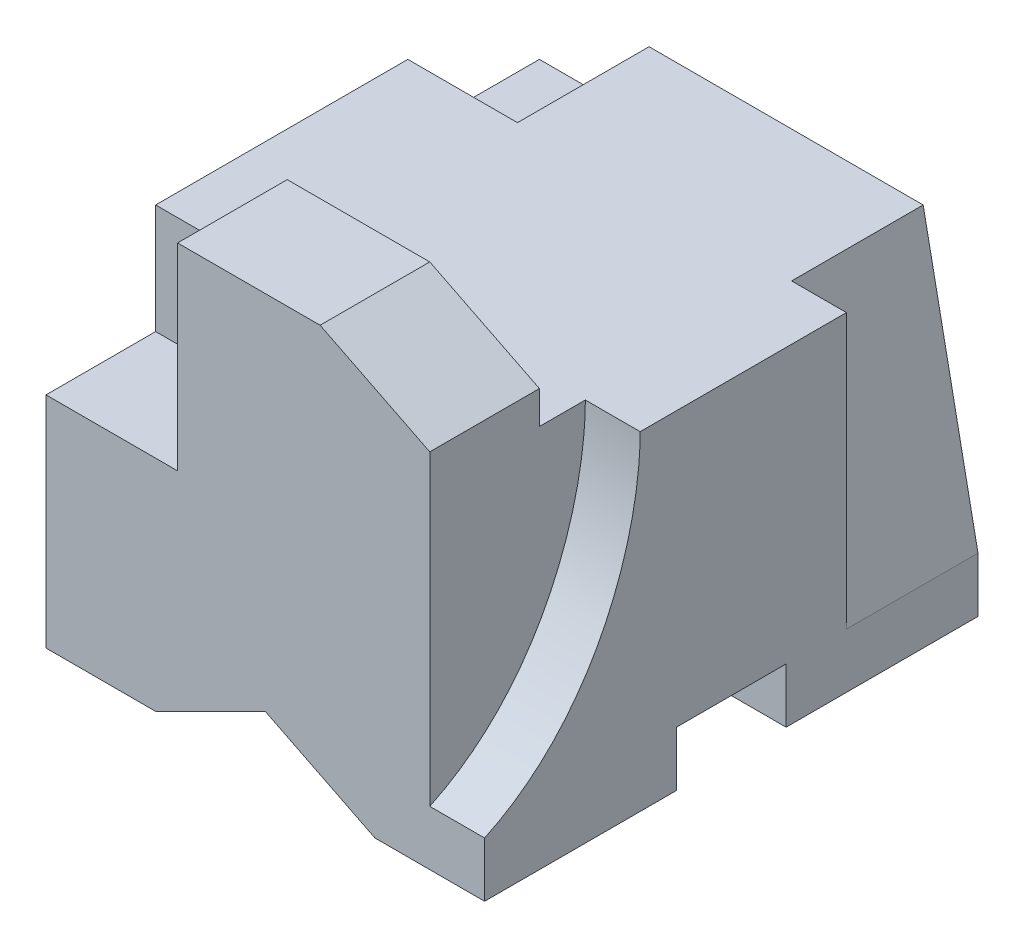
ISO-10303-21;
HEADER;
FILE_DESCRIPTION(('STEP AP214'),'2;1');
FILE_NAME('part.step','',(''),(''),'','','');
FILE_SCHEMA(('AUTOMOTIVE_DESIGN { 1 0 10303 214 1 1 1 1 }'));
ENDSEC;
DATA;
#1=APPLICATION_CONTEXT('core data for automotive mechanical design processes');
#2=APPLICATION_PROTOCOL_DEFINITION('international standard','automotive_design',2000,#1);
#3=PRODUCT_CONTEXT('',#1,'mechanical');
#4=PRODUCT('Part','Part','',(#3));
#5=PRODUCT_RELATED_PRODUCT_CATEGORY('part','',(#4));
#6=PRODUCT_DEFINITION_FORMATION('','',#4);
#7=PRODUCT_DEFINITION_CONTEXT('part definition',#1,'design');
#8=PRODUCT_DEFINITION('design','',#6,#7);
#9=PRODUCT_DEFINITION_SHAPE('','',#8);
#10=(LENGTH_UNIT() NAMED_UNIT(*) SI_UNIT(.MILLI.,.METRE.));
#11=(NAMED_UNIT(*) PLANE_ANGLE_UNIT() SI_UNIT($,.RADIAN.));
#12=(NAMED_UNIT(*) SI_UNIT($,.STERADIAN.) SOLID_ANGLE_UNIT());
#13=UNCERTAINTY_MEASURE_WITH_UNIT(LENGTH_MEASURE(1.E-05),#10,'distance_accuracy_value','');
#14=(GEOMETRIC_REPRESENTATION_CONTEXT(3) GLOBAL_UNCERTAINTY_ASSIGNED_CONTEXT((#13)) GLOBAL_UNIT_ASSIGNED_CONTEXT((#10,
#11,#12)) REPRESENTATION_CONTEXT('',''));
#15=CARTESIAN_POINT('',(0.,0.,0.));
#16=DIRECTION('',(0.,0.,1.));
#17=DIRECTION('',(1.,0.,0.));
#18=AXIS2_PLACEMENT_3D('',#15,#16,#17);
#19=CARTESIAN_POINT('',(40.,-15.,22.5));
#20=DIRECTION('',(0.,1.,0.));
#21=DIRECTION('',(0.,0.,1.));
#22=AXIS2_PLACEMENT_3D('',#19,#20,#21);
#23=PLANE('',#22);
#24=DIRECTION('',(1.,0.,0.));
#25=VECTOR('',#24,1.);
#26=CARTESIAN_POINT('',(0.,-15.,5.));
#27=LINE('',#26,#25);
#28=CARTESIAN_POINT('',(0.,-15.,5.));
#29=VERTEX_POINT('',#28);
#30=CARTESIAN_POINT('',(10.,-15.,4.99999999999999));
#31=VERTEX_POINT('',#30);
#32=EDGE_CURVE('E391',#29,#31,#27,.T.);
#33=ORIENTED_EDGE('',*,*,#32,.T.);
#34=DIRECTION('',(0.,0.,1.));
#35=VECTOR('',#34,1.);
#36=CARTESIAN_POINT('',(10.,-15.,-22.5));
#37=LINE('',#36,#35);
#38=CARTESIAN_POINT('',(10.,-15.,22.5));
#39=VERTEX_POINT('',#38);
#40=EDGE_CURVE('E314',#31,#39,#37,.T.);
#41=ORIENTED_EDGE('',*,*,#40,.T.);
#42=DIRECTION('',(-1.,0.,0.));
#43=VECTOR('',#42,1.);
#44=CARTESIAN_POINT('',(40.,-15.,22.5));
#45=LINE('',#44,#43);
#46=CARTESIAN_POINT('',(0.,-15.,22.5));
#47=VERTEX_POINT('',#46);
#48=EDGE_CURVE('E365',#39,#47,#45,.T.);
#49=ORIENTED_EDGE('',*,*,#48,.T.);
#50=DIRECTION('',(0.,0.,-1.));
#51=VECTOR('',#50,1.);
#52=CARTESIAN_POINT('',(0.,-15.,22.5));
#53=LINE('',#52,#51);
#54=EDGE_CURVE('E370',#47,#29,#53,.T.);
#55=ORIENTED_EDGE('',*,*,#54,.T.);
#56=EDGE_LOOP('',(#33,#41,#49,#55));
#57=FACE_BOUND('',#56,.T.);
#58=ADVANCED_FACE('F34',(#57),#23,.F.);
#59=DIRECTION('',(-1.,0.,0.));
#60=VECTOR('',#59,1.);
#61=CARTESIAN_POINT('',(40.,-15.,-22.5));
#62=LINE('',#61,#60);
#63=CARTESIAN_POINT('',(10.,-15.,-22.5));
#64=VERTEX_POINT('',#63);
#65=CARTESIAN_POINT('',(0.,-15.,-22.5));
#66=VERTEX_POINT('',#65);
#67=EDGE_CURVE('E369',#64,#66,#62,.T.);
#68=ORIENTED_EDGE('',*,*,#67,.F.);
#69=CARTESIAN_POINT('',(10.,-15.,-5.00000000000001));
#70=VERTEX_POINT('',#69);
#71=EDGE_CURVE('E326',#64,#70,#37,.T.);
#72=ORIENTED_EDGE('',*,*,#71,.T.);
#73=DIRECTION('',(1.,0.,0.));
#74=VECTOR('',#73,1.);
#75=CARTESIAN_POINT('',(0.,-15.,-5.));
#76=LINE('',#75,#74);
#77=CARTESIAN_POINT('',(0.,-15.,-5.));
#78=VERTEX_POINT('',#77);
#79=EDGE_CURVE('E396',#78,#70,#76,.T.);
#80=ORIENTED_EDGE('',*,*,#79,.F.);
#81=EDGE_CURVE('E374',#78,#66,#53,.T.);
#82=ORIENTED_EDGE('',*,*,#81,.T.);
#83=EDGE_LOOP('',(#68,#72,#80,#82));
#84=FACE_BOUND('',#83,.T.);
#85=ADVANCED_FACE('F482',(#84),#23,.F.);
#86=CARTESIAN_POINT('',(0.,0.,4.99999999999999));
#87=DIRECTION('',(0.,0.,-1.));
#88=DIRECTION('',(-1.,0.,0.));
#89=AXIS2_PLACEMENT_3D('',#86,#87,#88);
#90=PLANE('',#89);
#91=DIRECTION('',(0.894427190999916,0.447213595499958,0.));
#92=VECTOR('',#91,1.);
#93=CARTESIAN_POINT('',(8.,-16.,4.99999999999999));
#94=LINE('',#93,#92);
#95=CARTESIAN_POINT('',(20.,-9.99999999999999,4.99999999999999));
#96=VERTEX_POINT('',#95);
#97=EDGE_CURVE('E330',#31,#96,#94,.T.);
#98=ORIENTED_EDGE('',*,*,#97,.F.);
#99=ORIENTED_EDGE('',*,*,#32,.F.);
#100=DIRECTION('',(0.,1.,0.));
#101=VECTOR('',#100,1.);
#102=CARTESIAN_POINT('',(0.,0.,4.99999999999999));
#103=LINE('',#102,#101);
#104=CARTESIAN_POINT('',(0.,-9.99999999999999,4.99999999999999));
#105=VERTEX_POINT('',#104);
#106=EDGE_CURVE('E409',#29,#105,#103,.T.);
#107=ORIENTED_EDGE('',*,*,#106,.T.);
#108=DIRECTION('',(1.,0.,0.));
#109=VECTOR('',#108,1.);
#110=CARTESIAN_POINT('',(0.,-9.99999999999999,4.99999999999999));
#111=LINE('',#110,#109);
#112=EDGE_CURVE('E380',#105,#96,#111,.T.);
#113=ORIENTED_EDGE('',*,*,#112,.T.);
#114=EDGE_LOOP('',(#98,#99,#107,#113));
#115=FACE_BOUND('',#114,.T.);
#116=ADVANCED_FACE('F464',(#115),#90,.T.);
#117=CARTESIAN_POINT('',(0.,0.,-5.00000000000001));
#118=DIRECTION('',(0.,0.,-1.));
#119=DIRECTION('',(-1.,0.,0.));
#120=AXIS2_PLACEMENT_3D('',#117,#118,#119);
#121=PLANE('',#120);
#122=ORIENTED_EDGE('',*,*,#79,.T.);
#123=DIRECTION('',(0.894427190999916,0.447213595499958,0.));
#124=VECTOR('',#123,1.);
#125=CARTESIAN_POINT('',(8.,-16.,-5.00000000000001));
#126=LINE('',#125,#124);
#127=CARTESIAN_POINT('',(20.,-9.99999999999999,-5.00000000000001));
#128=VERTEX_POINT('',#127);
#129=EDGE_CURVE('E42',#70,#128,#126,.T.);
#130=ORIENTED_EDGE('',*,*,#129,.T.);
#131=DIRECTION('',(1.,0.,0.));
#132=VECTOR('',#131,1.);
#133=CARTESIAN_POINT('',(0.,-9.99999999999999,-5.00000000000001));
#134=LINE('',#133,#132);
#135=CARTESIAN_POINT('',(0.,-9.99999999999999,-5.00000000000001));
#136=VERTEX_POINT('',#135);
#137=EDGE_CURVE('E400',#136,#128,#134,.T.);
#138=ORIENTED_EDGE('',*,*,#137,.F.);
#139=DIRECTION('',(0.,1.,0.));
#140=VECTOR('',#139,1.);
#141=CARTESIAN_POINT('',(0.,0.,-5.00000000000001));
#142=LINE('',#141,#140);
#143=EDGE_CURVE('E420',#78,#136,#142,.T.);
#144=ORIENTED_EDGE('',*,*,#143,.F.);
#145=EDGE_LOOP('',(#122,#130,#138,#144));
#146=FACE_BOUND('',#145,.T.);
#147=ADVANCED_FACE('F459',(#146),#121,.F.);
#148=CARTESIAN_POINT('',(40.,-15.,22.5));
#149=VERTEX_POINT('',#148);
#150=CARTESIAN_POINT('',(30.,-15.,22.5));
#151=VERTEX_POINT('',#150);
#152=EDGE_CURVE('E362',#149,#151,#45,.T.);
#153=ORIENTED_EDGE('',*,*,#152,.T.);
#154=DIRECTION('',(0.,0.,1.));
#155=VECTOR('',#154,1.);
#156=CARTESIAN_POINT('',(30.,-15.,-22.5));
#157=LINE('',#156,#155);
#158=CARTESIAN_POINT('',(30.,-15.,4.99999999999999));
#159=VERTEX_POINT('',#158);
#160=EDGE_CURVE('E325',#159,#151,#157,.T.);
#161=ORIENTED_EDGE('',*,*,#160,.F.);
#162=CARTESIAN_POINT('',(40.,-15.,5.));
#163=VERTEX_POINT('',#162);
#164=EDGE_CURVE('E395',#159,#163,#27,.T.);
#165=ORIENTED_EDGE('',*,*,#164,.T.);
#166=DIRECTION('',(0.,0.,-1.));
#167=VECTOR('',#166,1.);
#168=CARTESIAN_POINT('',(40.,-15.,22.5));
#169=LINE('',#168,#167);
#170=EDGE_CURVE('E381',#149,#163,#169,.T.);
#171=ORIENTED_EDGE('',*,*,#170,.F.);
#172=EDGE_LOOP('',(#153,#161,#165,#171));
#173=FACE_BOUND('',#172,.T.);
#174=ADVANCED_FACE('F468',(#173),#23,.F.);
#175=CARTESIAN_POINT('',(40.,0.,0.));
#176=DIRECTION('',(-1.,0.,0.));
#177=DIRECTION('',(0.,0.,1.));
#178=AXIS2_PLACEMENT_3D('',#175,#176,#177);
#179=PLANE('',#178);
#180=DIRECTION('',(0.,1.,0.));
#181=VECTOR('',#180,1.);
#182=CARTESIAN_POINT('',(40.,-15.,-22.5));
#183=LINE('',#182,#181);
#184=CARTESIAN_POINT('',(40.,-15.,-22.5));
#185=VERTEX_POINT('',#184);
#186=CARTESIAN_POINT('',(40.,-9.99999999999999,-22.5));
#187=VERTEX_POINT('',#186);
#188=EDGE_CURVE('E373',#185,#187,#183,.T.);
#189=ORIENTED_EDGE('',*,*,#188,.T.);
#190=DIRECTION('',(0.,0.,-1.));
#191=VECTOR('',#190,1.);
#192=CARTESIAN_POINT('',(40.,-9.99999999999999,-10.5));
#193=LINE('',#192,#191);
#194=CARTESIAN_POINT('',(40.,-9.99999999999999,-10.5));
#195=VERTEX_POINT('',#194);
#196=EDGE_CURVE('E341',#195,#187,#193,.T.);
#197=ORIENTED_EDGE('',*,*,#196,.F.);
#198=DIRECTION('',(0.,-1.,0.));
#199=VECTOR('',#198,1.);
#200=CARTESIAN_POINT('',(40.,-9.99999999999999,-10.5));
#201=LINE('',#200,#199);
#202=CARTESIAN_POINT('',(40.,15.,-10.5));
#203=VERTEX_POINT('',#202);
#204=EDGE_CURVE('E334',#203,#195,#201,.T.);
#205=ORIENTED_EDGE('',*,*,#204,.F.);
#206=DIRECTION('',(0.,0.,1.));
#207=VECTOR('',#206,1.);
#208=CARTESIAN_POINT('',(40.,15.,22.5));
#209=LINE('',#208,#207);
#210=CARTESIAN_POINT('',(40.,15.,8.30991112159884));
#211=VERTEX_POINT('',#210);
#212=EDGE_CURVE('E387',#203,#211,#209,.T.);
#213=ORIENTED_EDGE('',*,*,#212,.T.);
#214=CARTESIAN_POINT('',(40.,-9.99999999999999,22.5));
#215=CARTESIAN_POINT('',(40.,-5.2923953588968,12.4623301841292));
#216=CARTESIAN_POINT('',(40.,6.5811893556988,8.30991112159884));
#217=CARTESIAN_POINT('',(40.,15.,8.30991112159884));
#218=B_SPLINE_CURVE_WITH_KNOTS('',3,(#214,#215,#216,#217),.UNSPECIFIED.,.F.,.F.,(4,4),(0.,1.),.UNSPECIFIED.);
#219=CARTESIAN_POINT('',(40.,-9.99999999999999,22.5));
#220=VERTEX_POINT('',#219);
#221=EDGE_CURVE('E346',#220,#211,#218,.T.);
#222=ORIENTED_EDGE('',*,*,#221,.F.);
#223=DIRECTION('',(0.,-1.,0.));
#224=VECTOR('',#223,1.);
#225=CARTESIAN_POINT('',(40.,-15.,22.5));
#226=LINE('',#225,#224);
#227=EDGE_CURVE('E385',#220,#149,#226,.T.);
#228=ORIENTED_EDGE('',*,*,#227,.T.);
#229=ORIENTED_EDGE('',*,*,#170,.T.);
#230=DIRECTION('',(0.,1.,0.));
#231=VECTOR('',#230,1.);
#232=CARTESIAN_POINT('',(40.,0.,4.99999999999999));
#233=LINE('',#232,#231);
#234=CARTESIAN_POINT('',(40.,-9.99999999999999,4.99999999999999));
#235=VERTEX_POINT('',#234);
#236=EDGE_CURVE('E413',#163,#235,#233,.T.);
#237=ORIENTED_EDGE('',*,*,#236,.T.);
#238=DIRECTION('',(0.,0.,-1.));
#239=VECTOR('',#238,1.);
#240=CARTESIAN_POINT('',(40.,-9.99999999999999,0.));
#241=LINE('',#240,#239);
#242=CARTESIAN_POINT('',(40.,-9.99999999999999,-5.00000000000001));
#243=VERTEX_POINT('',#242);
#244=EDGE_CURVE('E406',#235,#243,#241,.T.);
#245=ORIENTED_EDGE('',*,*,#244,.T.);
#246=DIRECTION('',(0.,1.,0.));
#247=VECTOR('',#246,1.);
#248=CARTESIAN_POINT('',(40.,0.,-5.00000000000001));
#249=LINE('',#248,#247);
#250=CARTESIAN_POINT('',(40.,-15.,-5.));
#251=VERTEX_POINT('',#250);
#252=EDGE_CURVE('E410',#251,#243,#249,.T.);
#253=ORIENTED_EDGE('',*,*,#252,.F.);
#254=EDGE_CURVE('E384',#251,#185,#169,.T.);
#255=ORIENTED_EDGE('',*,*,#254,.T.);
#256=EDGE_LOOP('',(#189,#197,#205,#213,#222,#228,#229,#237,#245,#253,#255));
#257=FACE_BOUND('',#256,.T.);
#258=ADVANCED_FACE('F465',(#257),#179,.F.);
#259=CARTESIAN_POINT('',(0.,0.,0.));
#260=DIRECTION('',(-1.,0.,0.));
#261=DIRECTION('',(0.,0.,1.));
#262=AXIS2_PLACEMENT_3D('',#259,#260,#261);
#263=PLANE('',#262);
#264=DIRECTION('',(0.,0.,1.));
#265=VECTOR('',#264,1.);
#266=CARTESIAN_POINT('',(0.,5.,8.30991112159884));
#267=LINE('',#266,#265);
#268=CARTESIAN_POINT('',(0.,5.,12.5));
#269=VERTEX_POINT('',#268);
#270=CARTESIAN_POINT('',(0.,5.,22.5));
#271=VERTEX_POINT('',#270);
#272=EDGE_CURVE('E296',#269,#271,#267,.T.);
#273=ORIENTED_EDGE('',*,*,#272,.F.);
#274=DIRECTION('',(0.,-1.,0.));
#275=VECTOR('',#274,1.);
#276=CARTESIAN_POINT('',(0.,15.,12.5));
#277=LINE('',#276,#275);
#278=CARTESIAN_POINT('',(0.,15.,12.5));
#279=VERTEX_POINT('',#278);
#280=EDGE_CURVE('E224',#279,#269,#277,.T.);
#281=ORIENTED_EDGE('',*,*,#280,.F.);
#282=DIRECTION('',(0.,0.,1.));
#283=VECTOR('',#282,1.);
#284=CARTESIAN_POINT('',(0.,15.,22.5));
#285=LINE('',#284,#283);
#286=CARTESIAN_POINT('',(0.,15.,-10.5));
#287=VERTEX_POINT('',#286);
#288=EDGE_CURVE('E286',#287,#279,#285,.T.);
#289=ORIENTED_EDGE('',*,*,#288,.F.);
#290=DIRECTION('',(0.,1.,0.));
#291=VECTOR('',#290,1.);
#292=CARTESIAN_POINT('',(0.,9.,-10.5));
#293=LINE('',#292,#291);
#294=CARTESIAN_POINT('',(0.,9.,-10.5));
#295=VERTEX_POINT('',#294);
#296=EDGE_CURVE('E251',#295,#287,#293,.T.);
#297=ORIENTED_EDGE('',*,*,#296,.F.);
#298=DIRECTION('',(0.,0.,1.));
#299=VECTOR('',#298,1.);
#300=CARTESIAN_POINT('',(0.,9.,-22.5));
#301=LINE('',#300,#299);
#302=CARTESIAN_POINT('',(0.,9.,-22.5));
#303=VERTEX_POINT('',#302);
#304=EDGE_CURVE('E246',#303,#295,#301,.T.);
#305=ORIENTED_EDGE('',*,*,#304,.F.);
#306=DIRECTION('',(0.,1.,0.));
#307=VECTOR('',#306,1.);
#308=CARTESIAN_POINT('',(0.,-15.,-22.5));
#309=LINE('',#308,#307);
#310=EDGE_CURVE('E377',#66,#303,#309,.T.);
#311=ORIENTED_EDGE('',*,*,#310,.F.);
#312=ORIENTED_EDGE('',*,*,#81,.F.);
#313=ORIENTED_EDGE('',*,*,#143,.T.);
#314=DIRECTION('',(0.,0.,-1.));
#315=VECTOR('',#314,1.);
#316=CARTESIAN_POINT('',(0.,-9.99999999999999,0.));
#317=LINE('',#316,#315);
#318=EDGE_CURVE('E417',#105,#136,#317,.T.);
#319=ORIENTED_EDGE('',*,*,#318,.F.);
#320=ORIENTED_EDGE('',*,*,#106,.F.);
#321=ORIENTED_EDGE('',*,*,#54,.F.);
#322=DIRECTION('',(0.,-1.,0.));
#323=VECTOR('',#322,1.);
#324=CARTESIAN_POINT('',(0.,-15.,22.5));
#325=LINE('',#324,#323);
#326=EDGE_CURVE('E298',#271,#47,#325,.T.);
#327=ORIENTED_EDGE('',*,*,#326,.F.);
#328=EDGE_LOOP('',(#273,#281,#289,#297,#305,#311,#312,#313,#319,#320,#321,#327));
#329=FACE_BOUND('',#328,.T.);
#330=ADVANCED_FACE('F293',(#329),#263,.T.);
#331=CARTESIAN_POINT('',(40.,-15.,-22.5));
#332=DIRECTION('',(0.,0.,1.));
#333=DIRECTION('',(1.,0.,0.));
#334=AXIS2_PLACEMENT_3D('',#331,#332,#333);
#335=PLANE('',#334);
#336=ORIENTED_EDGE('',*,*,#310,.T.);
#337=DIRECTION('',(-1.,0.,0.));
#338=VECTOR('',#337,1.);
#339=CARTESIAN_POINT('',(10.,9.,-22.5));
#340=LINE('',#339,#338);
#341=CARTESIAN_POINT('',(10.,9.,-22.5));
#342=VERTEX_POINT('',#341);
#343=EDGE_CURVE('E256',#342,#303,#340,.T.);
#344=ORIENTED_EDGE('',*,*,#343,.F.);
#345=DIRECTION('',(0.,-1.,0.));
#346=VECTOR('',#345,1.);
#347=CARTESIAN_POINT('',(10.,15.,-22.5));
#348=LINE('',#347,#346);
#349=CARTESIAN_POINT('',(10.,15.,-22.5));
#350=VERTEX_POINT('',#349);
#351=EDGE_CURVE('E247',#350,#342,#348,.T.);
#352=ORIENTED_EDGE('',*,*,#351,.F.);
#353=DIRECTION('',(-1.,0.,0.));
#354=VECTOR('',#353,1.);
#355=CARTESIAN_POINT('',(40.,15.,-22.5));
#356=LINE('',#355,#354);
#357=CARTESIAN_POINT('',(35.,15.,-22.5));
#358=VERTEX_POINT('',#357);
#359=EDGE_CURVE('E359',#358,#350,#356,.T.);
#360=ORIENTED_EDGE('',*,*,#359,.F.);
#361=DIRECTION('',(-0.196116135138184,0.98058067569092,0.));
#362=VECTOR('',#361,1.);
#363=CARTESIAN_POINT('',(35.,15.,-22.5));
#364=LINE('',#363,#362);
#365=EDGE_CURVE('E333',#187,#358,#364,.T.);
#366=ORIENTED_EDGE('',*,*,#365,.F.);
#367=ORIENTED_EDGE('',*,*,#188,.F.);
#368=CARTESIAN_POINT('',(30.,-15.,-22.5));
#369=VERTEX_POINT('',#368);
#370=EDGE_CURVE('E366',#185,#369,#62,.T.);
#371=ORIENTED_EDGE('',*,*,#370,.T.);
#372=DIRECTION('',(-0.894427190999916,0.447213595499958,0.));
#373=VECTOR('',#372,1.);
#374=CARTESIAN_POINT('',(20.,-9.99999999999999,-22.5));
#375=LINE('',#374,#373);
#376=CARTESIAN_POINT('',(20.,-9.99999999999999,-22.5));
#377=VERTEX_POINT('',#376);
#378=EDGE_CURVE('E312',#369,#377,#375,.T.);
#379=ORIENTED_EDGE('',*,*,#378,.T.);
#380=DIRECTION('',(-0.894427190999916,-0.447213595499958,0.));
#381=VECTOR('',#380,1.);
#382=CARTESIAN_POINT('',(20.,-9.99999999999999,-22.5));
#383=LINE('',#382,#381);
#384=EDGE_CURVE('E309',#377,#64,#383,.T.);
#385=ORIENTED_EDGE('',*,*,#384,.T.);
#386=ORIENTED_EDGE('',*,*,#67,.T.);
#387=EDGE_LOOP('',(#336,#344,#352,#360,#366,#367,#371,#379,#385,#386));
#388=FACE_BOUND('',#387,.T.);
#389=ADVANCED_FACE('F36',(#388),#335,.F.);
#390=CARTESIAN_POINT('',(40.,15.,22.5));
#391=DIRECTION('',(0.,-1.,0.));
#392=DIRECTION('',(0.,0.,-1.));
#393=AXIS2_PLACEMENT_3D('',#390,#391,#392);
#394=PLANE('',#393);
#395=ORIENTED_EDGE('',*,*,#288,.T.);
#396=DIRECTION('',(1.,0.,0.));
#397=VECTOR('',#396,1.);
#398=CARTESIAN_POINT('',(5.,15.,12.5));
#399=LINE('',#398,#397);
#400=CARTESIAN_POINT('',(12.,15.,12.5));
#401=VERTEX_POINT('',#400);
#402=EDGE_CURVE('E272',#279,#401,#399,.T.);
#403=ORIENTED_EDGE('',*,*,#402,.T.);
#404=CARTESIAN_POINT('',(35.,15.,12.5));
#405=VERTEX_POINT('',#404);
#406=EDGE_CURVE('E57',#401,#405,#399,.T.);
#407=ORIENTED_EDGE('',*,*,#406,.T.);
#408=DIRECTION('',(0.,0.,1.));
#409=VECTOR('',#408,1.);
#410=CARTESIAN_POINT('',(35.,15.,22.5));
#411=LINE('',#410,#409);
#412=CARTESIAN_POINT('',(35.,15.,8.30991112159884));
#413=VERTEX_POINT('',#412);
#414=EDGE_CURVE('E352',#413,#405,#411,.T.);
#415=ORIENTED_EDGE('',*,*,#414,.F.);
#416=DIRECTION('',(1.,0.,0.));
#417=VECTOR('',#416,1.);
#418=CARTESIAN_POINT('',(35.,15.,8.30991112159884));
#419=LINE('',#418,#417);
#420=EDGE_CURVE('E416',#413,#211,#419,.T.);
#421=ORIENTED_EDGE('',*,*,#420,.T.);
#422=ORIENTED_EDGE('',*,*,#212,.F.);
#423=DIRECTION('',(1.,0.,0.));
#424=VECTOR('',#423,1.);
#425=CARTESIAN_POINT('',(40.,15.,-10.5));
#426=LINE('',#425,#424);
#427=CARTESIAN_POINT('',(35.,15.,-10.5));
#428=VERTEX_POINT('',#427);
#429=EDGE_CURVE('E339',#428,#203,#426,.T.);
#430=ORIENTED_EDGE('',*,*,#429,.F.);
#431=DIRECTION('',(0.,0.,-1.));
#432=VECTOR('',#431,1.);
#433=CARTESIAN_POINT('',(35.,15.,-10.5));
#434=LINE('',#433,#432);
#435=EDGE_CURVE('E343',#428,#358,#434,.T.);
#436=ORIENTED_EDGE('',*,*,#435,.T.);
#437=ORIENTED_EDGE('',*,*,#359,.T.);
#438=DIRECTION('',(0.,0.,-1.));
#439=VECTOR('',#438,1.);
#440=CARTESIAN_POINT('',(10.,15.,-10.5));
#441=LINE('',#440,#439);
#442=CARTESIAN_POINT('',(10.,15.,-10.5));
#443=VERTEX_POINT('',#442);
#444=EDGE_CURVE('E254',#443,#350,#441,.T.);
#445=ORIENTED_EDGE('',*,*,#444,.F.);
#446=DIRECTION('',(-1.,0.,0.));
#447=VECTOR('',#446,1.);
#448=CARTESIAN_POINT('',(10.,15.,-10.5));
#449=LINE('',#448,#447);
#450=EDGE_CURVE('E260',#443,#287,#449,.T.);
#451=ORIENTED_EDGE('',*,*,#450,.T.);
#452=EDGE_LOOP('',(#395,#403,#407,#415,#421,#422,#430,#436,#437,#445,#451));
#453=FACE_BOUND('',#452,.T.);
#454=ADVANCED_FACE('F284',(#453),#394,.F.);
#455=CARTESIAN_POINT('',(40.,-15.,22.5));
#456=DIRECTION('',(0.,0.,-1.));
#457=DIRECTION('',(-1.,0.,0.));
#458=AXIS2_PLACEMENT_3D('',#455,#456,#457);
#459=PLANE('',#458);
#460=DIRECTION('',(-1.,0.,0.));
#461=VECTOR('',#460,1.);
#462=CARTESIAN_POINT('',(25.,23.,22.5));
#463=LINE('',#462,#461);
#464=CARTESIAN_POINT('',(25.,23.,22.5));
#465=VERTEX_POINT('',#464);
#466=CARTESIAN_POINT('',(12.,23.,22.5));
#467=VERTEX_POINT('',#466);
#468=EDGE_CURVE('E228',#465,#467,#463,.T.);
#469=ORIENTED_EDGE('',*,*,#468,.T.);
#470=DIRECTION('',(0.,1.,0.));
#471=VECTOR('',#470,1.);
#472=CARTESIAN_POINT('',(12.,5.,22.5));
#473=LINE('',#472,#471);
#474=CARTESIAN_POINT('',(12.,5.,22.5));
#475=VERTEX_POINT('',#474);
#476=EDGE_CURVE('E214',#475,#467,#473,.T.);
#477=ORIENTED_EDGE('',*,*,#476,.F.);
#478=DIRECTION('',(1.,0.,0.));
#479=VECTOR('',#478,1.);
#480=CARTESIAN_POINT('',(0.,5.,22.5));
#481=LINE('',#480,#479);
#482=EDGE_CURVE('E301',#271,#475,#481,.T.);
#483=ORIENTED_EDGE('',*,*,#482,.F.);
#484=ORIENTED_EDGE('',*,*,#326,.T.);
#485=ORIENTED_EDGE('',*,*,#48,.F.);
#486=DIRECTION('',(-0.894427190999916,-0.447213595499958,0.));
#487=VECTOR('',#486,1.);
#488=CARTESIAN_POINT('',(20.,-9.99999999999999,22.5));
#489=LINE('',#488,#487);
#490=CARTESIAN_POINT('',(20.,-9.99999999999999,22.5));
#491=VERTEX_POINT('',#490);
#492=EDGE_CURVE('E300',#491,#39,#489,.T.);
#493=ORIENTED_EDGE('',*,*,#492,.F.);
#494=DIRECTION('',(-0.894427190999916,0.447213595499958,0.));
#495=VECTOR('',#494,1.);
#496=CARTESIAN_POINT('',(20.,-9.99999999999999,22.5));
#497=LINE('',#496,#495);
#498=EDGE_CURVE('E303',#151,#491,#497,.T.);
#499=ORIENTED_EDGE('',*,*,#498,.F.);
#500=ORIENTED_EDGE('',*,*,#152,.F.);
#501=ORIENTED_EDGE('',*,*,#227,.F.);
#502=DIRECTION('',(1.,0.,0.));
#503=VECTOR('',#502,1.);
#504=CARTESIAN_POINT('',(35.,-9.99999999999999,22.5));
#505=LINE('',#504,#503);
#506=CARTESIAN_POINT('',(35.,-9.99999999999999,22.5));
#507=VERTEX_POINT('',#506);
#508=EDGE_CURVE('E424',#507,#220,#505,.T.);
#509=ORIENTED_EDGE('',*,*,#508,.F.);
#510=DIRECTION('',(0.,-1.,0.));
#511=VECTOR('',#510,1.);
#512=CARTESIAN_POINT('',(35.,15.,22.5));
#513=LINE('',#512,#511);
#514=CARTESIAN_POINT('',(35.,18.,22.5));
#515=VERTEX_POINT('',#514);
#516=EDGE_CURVE('E350',#515,#507,#513,.T.);
#517=ORIENTED_EDGE('',*,*,#516,.F.);
#518=DIRECTION('',(-0.894427190999916,0.447213595499958,0.));
#519=VECTOR('',#518,1.);
#520=CARTESIAN_POINT('',(35.,18.,22.5));
#521=LINE('',#520,#519);
#522=EDGE_CURVE('E231',#515,#465,#521,.T.);
#523=ORIENTED_EDGE('',*,*,#522,.T.);
#524=EDGE_LOOP('',(#469,#477,#483,#484,#485,#493,#499,#500,#501,#509,#517,#523));
#525=FACE_BOUND('',#524,.T.);
#526=ADVANCED_FACE('F229',(#525),#459,.F.);
#527=CARTESIAN_POINT('',(30.,-15.,-5.));
#528=VERTEX_POINT('',#527);
#529=EDGE_CURVE('E394',#528,#251,#76,.T.);
#530=ORIENTED_EDGE('',*,*,#529,.F.);
#531=EDGE_CURVE('E323',#369,#528,#157,.T.);
#532=ORIENTED_EDGE('',*,*,#531,.F.);
#533=ORIENTED_EDGE('',*,*,#370,.F.);
#534=ORIENTED_EDGE('',*,*,#254,.F.);
#535=EDGE_LOOP('',(#530,#532,#533,#534));
#536=FACE_BOUND('',#535,.T.);
#537=ADVANCED_FACE('F462',(#536),#23,.F.);
#538=DIRECTION('',(0.894427190999916,-0.447213595499958,0.));
#539=VECTOR('',#538,1.);
#540=CARTESIAN_POINT('',(0.,0.,4.99999999999999));
#541=LINE('',#540,#539);
#542=EDGE_CURVE('E321',#96,#159,#541,.T.);
#543=ORIENTED_EDGE('',*,*,#542,.F.);
#544=EDGE_CURVE('E403',#96,#235,#111,.T.);
#545=ORIENTED_EDGE('',*,*,#544,.T.);
#546=ORIENTED_EDGE('',*,*,#236,.F.);
#547=ORIENTED_EDGE('',*,*,#164,.F.);
#548=EDGE_LOOP('',(#543,#545,#546,#547));
#549=FACE_BOUND('',#548,.T.);
#550=ADVANCED_FACE('F454',(#549),#90,.T.);
#551=CARTESIAN_POINT('',(0.,-9.99999999999999,0.));
#552=DIRECTION('',(0.,-1.,0.));
#553=DIRECTION('',(0.,0.,-1.));
#554=AXIS2_PLACEMENT_3D('',#551,#552,#553);
#555=PLANE('',#554);
#556=ORIENTED_EDGE('',*,*,#544,.F.);
#557=ORIENTED_EDGE('',*,*,#112,.F.);
#558=ORIENTED_EDGE('',*,*,#318,.T.);
#559=ORIENTED_EDGE('',*,*,#137,.T.);
#560=EDGE_CURVE('E399',#128,#243,#134,.T.);
#561=ORIENTED_EDGE('',*,*,#560,.T.);
#562=ORIENTED_EDGE('',*,*,#244,.F.);
#563=EDGE_LOOP('',(#556,#557,#558,#559,#561,#562));
#564=FACE_BOUND('',#563,.T.);
#565=ADVANCED_FACE('F451',(#564),#555,.T.);
#566=ORIENTED_EDGE('',*,*,#560,.F.);
#567=DIRECTION('',(0.894427190999916,-0.447213595499958,0.));
#568=VECTOR('',#567,1.);
#569=CARTESIAN_POINT('',(0.,0.,-5.00000000000001));
#570=LINE('',#569,#568);
#571=EDGE_CURVE('E356',#128,#528,#570,.T.);
#572=ORIENTED_EDGE('',*,*,#571,.T.);
#573=ORIENTED_EDGE('',*,*,#529,.T.);
#574=ORIENTED_EDGE('',*,*,#252,.T.);
#575=EDGE_LOOP('',(#566,#572,#573,#574));
#576=FACE_BOUND('',#575,.T.);
#577=ADVANCED_FACE('F448',(#576),#121,.F.);
#578=CARTESIAN_POINT('',(35.,-9.99999999999999,22.5));
#579=CARTESIAN_POINT('',(35.,-5.2923953588968,12.4623301841292));
#580=CARTESIAN_POINT('',(35.,6.5811893556988,8.30991112159884));
#581=CARTESIAN_POINT('',(35.,15.,8.30991112159884));
#582=B_SPLINE_CURVE_WITH_KNOTS('',3,(#578,#579,#580,#581),.UNSPECIFIED.,.F.,.F.,(4,4),(0.,1.),.UNSPECIFIED.);
#583=DIRECTION('',(1.,0.,0.));
#584=VECTOR('',#583,1.);
#585=SURFACE_OF_LINEAR_EXTRUSION('',#582,#584);
#586=ORIENTED_EDGE('',*,*,#221,.T.);
#587=ORIENTED_EDGE('',*,*,#420,.F.);
#588=EDGE_CURVE('E426',#507,#413,#582,.T.);
#589=ORIENTED_EDGE('',*,*,#588,.F.);
#590=ORIENTED_EDGE('',*,*,#508,.T.);
#591=EDGE_LOOP('',(#586,#587,#589,#590));
#592=FACE_BOUND('',#591,.T.);
#593=ADVANCED_FACE('F443',(#592),#585,.F.);
#594=CARTESIAN_POINT('',(35.,1.10829774880075,11.6408293798479));
#595=DIRECTION('',(1.,0.,0.));
#596=DIRECTION('',(0.,0.,-1.));
#597=AXIS2_PLACEMENT_3D('',#594,#595,#596);
#598=PLANE('',#597);
#599=ORIENTED_EDGE('',*,*,#414,.T.);
#600=DIRECTION('',(0.,1.,0.));
#601=VECTOR('',#600,1.);
#602=CARTESIAN_POINT('',(35.,15.,12.5));
#603=LINE('',#602,#601);
#604=CARTESIAN_POINT('',(35.,18.,12.5));
#605=VERTEX_POINT('',#604);
#606=EDGE_CURVE('E277',#405,#605,#603,.T.);
#607=ORIENTED_EDGE('',*,*,#606,.T.);
#608=DIRECTION('',(0.,0.,1.));
#609=VECTOR('',#608,1.);
#610=CARTESIAN_POINT('',(35.,18.,12.5));
#611=LINE('',#610,#609);
#612=EDGE_CURVE('E564',#605,#515,#611,.T.);
#613=ORIENTED_EDGE('',*,*,#612,.T.);
#614=ORIENTED_EDGE('',*,*,#516,.T.);
#615=ORIENTED_EDGE('',*,*,#588,.T.);
#616=EDGE_LOOP('',(#599,#607,#613,#614,#615));
#617=FACE_BOUND('',#616,.T.);
#618=ADVANCED_FACE('F447',(#617),#598,.T.);
#619=CARTESIAN_POINT('',(35.,15.,-10.5));
#620=DIRECTION('',(-0.98058067569092,-0.196116135138184,0.));
#621=DIRECTION('',(0.196116135138184,-0.98058067569092,0.));
#622=AXIS2_PLACEMENT_3D('',#619,#620,#621);
#623=PLANE('',#622);
#624=ORIENTED_EDGE('',*,*,#365,.T.);
#625=ORIENTED_EDGE('',*,*,#435,.F.);
#626=DIRECTION('',(-0.196116135138184,0.98058067569092,0.));
#627=VECTOR('',#626,1.);
#628=CARTESIAN_POINT('',(35.,15.,-10.5));
#629=LINE('',#628,#627);
#630=EDGE_CURVE('E337',#195,#428,#629,.T.);
#631=ORIENTED_EDGE('',*,*,#630,.F.);
#632=ORIENTED_EDGE('',*,*,#196,.T.);
#633=EDGE_LOOP('',(#624,#625,#631,#632));
#634=FACE_BOUND('',#633,.T.);
#635=ADVANCED_FACE('F529',(#634),#623,.F.);
#636=CARTESIAN_POINT('',(0.,0.,-10.5));
#637=DIRECTION('',(0.,0.,1.));
#638=DIRECTION('',(1.,0.,0.));
#639=AXIS2_PLACEMENT_3D('',#636,#637,#638);
#640=PLANE('',#639);
#641=ORIENTED_EDGE('',*,*,#204,.T.);
#642=ORIENTED_EDGE('',*,*,#630,.T.);
#643=ORIENTED_EDGE('',*,*,#429,.T.);
#644=EDGE_LOOP('',(#641,#642,#643));
#645=FACE_BOUND('',#644,.T.);
#646=ADVANCED_FACE('F527',(#645),#640,.F.);
#647=CARTESIAN_POINT('',(20.,-9.99999999999999,-22.5));
#648=DIRECTION('',(0.447213595499958,0.894427190999916,0.));
#649=DIRECTION('',(-0.894427190999916,0.447213595499958,0.));
#650=AXIS2_PLACEMENT_3D('',#647,#648,#649);
#651=PLANE('',#650);
#652=DIRECTION('',(0.,0.,1.));
#653=VECTOR('',#652,1.);
#654=CARTESIAN_POINT('',(20.,-9.99999999999999,-22.5));
#655=LINE('',#654,#653);
#656=EDGE_CURVE('E318',#377,#128,#655,.T.);
#657=ORIENTED_EDGE('',*,*,#656,.F.);
#658=ORIENTED_EDGE('',*,*,#378,.F.);
#659=ORIENTED_EDGE('',*,*,#531,.T.);
#660=ORIENTED_EDGE('',*,*,#571,.F.);
#661=EDGE_LOOP('',(#657,#658,#659,#660));
#662=FACE_BOUND('',#661,.T.);
#663=ADVANCED_FACE('F523',(#662),#651,.F.);
#664=CARTESIAN_POINT('',(20.,-9.99999999999999,-22.5));
#665=DIRECTION('',(-0.447213595499958,0.894427190999916,0.));
#666=DIRECTION('',(-0.894427190999916,-0.447213595499958,0.));
#667=AXIS2_PLACEMENT_3D('',#664,#665,#666);
#668=PLANE('',#667);
#669=ORIENTED_EDGE('',*,*,#71,.F.);
#670=ORIENTED_EDGE('',*,*,#384,.F.);
#671=ORIENTED_EDGE('',*,*,#656,.T.);
#672=ORIENTED_EDGE('',*,*,#129,.F.);
#673=EDGE_LOOP('',(#669,#670,#671,#672));
#674=FACE_BOUND('',#673,.T.);
#675=ADVANCED_FACE('F515',(#674),#668,.F.);
#676=ORIENTED_EDGE('',*,*,#97,.T.);
#677=EDGE_CURVE('E322',#96,#491,#655,.T.);
#678=ORIENTED_EDGE('',*,*,#677,.T.);
#679=ORIENTED_EDGE('',*,*,#492,.T.);
#680=ORIENTED_EDGE('',*,*,#40,.F.);
#681=EDGE_LOOP('',(#676,#678,#679,#680));
#682=FACE_BOUND('',#681,.T.);
#683=ADVANCED_FACE('F513',(#682),#668,.F.);
#684=ORIENTED_EDGE('',*,*,#542,.T.);
#685=ORIENTED_EDGE('',*,*,#160,.T.);
#686=ORIENTED_EDGE('',*,*,#498,.T.);
#687=ORIENTED_EDGE('',*,*,#677,.F.);
#688=EDGE_LOOP('',(#684,#685,#686,#687));
#689=FACE_BOUND('',#688,.T.);
#690=ADVANCED_FACE('F504',(#689),#651,.F.);
#691=CARTESIAN_POINT('',(0.,5.,8.30991112159884));
#692=DIRECTION('',(0.,-1.,0.));
#693=DIRECTION('',(0.,0.,-1.));
#694=AXIS2_PLACEMENT_3D('',#691,#692,#693);
#695=PLANE('',#694);
#696=DIRECTION('',(-1.,0.,0.));
#697=VECTOR('',#696,1.);
#698=CARTESIAN_POINT('',(0.,5.,12.5));
#699=LINE('',#698,#697);
#700=CARTESIAN_POINT('',(12.,5.,12.5));
#701=VERTEX_POINT('',#700);
#702=EDGE_CURVE('E242',#701,#269,#699,.T.);
#703=ORIENTED_EDGE('',*,*,#702,.T.);
#704=ORIENTED_EDGE('',*,*,#272,.T.);
#705=ORIENTED_EDGE('',*,*,#482,.T.);
#706=DIRECTION('',(0.,0.,1.));
#707=VECTOR('',#706,1.);
#708=CARTESIAN_POINT('',(12.,5.,-9.13330765278397));
#709=LINE('',#708,#707);
#710=EDGE_CURVE('E221',#701,#475,#709,.T.);
#711=ORIENTED_EDGE('',*,*,#710,.F.);
#712=EDGE_LOOP('',(#703,#704,#705,#711));
#713=FACE_BOUND('',#712,.T.);
#714=ADVANCED_FACE('F521',(#713),#695,.F.);
#715=CARTESIAN_POINT('',(25.,23.,12.5));
#716=DIRECTION('',(0.,1.,0.));
#717=DIRECTION('',(0.,0.,1.));
#718=AXIS2_PLACEMENT_3D('',#715,#716,#717);
#719=PLANE('',#718);
#720=ORIENTED_EDGE('',*,*,#468,.F.);
#721=DIRECTION('',(0.,0.,1.));
#722=VECTOR('',#721,1.);
#723=CARTESIAN_POINT('',(25.,23.,12.5));
#724=LINE('',#723,#722);
#725=CARTESIAN_POINT('',(25.,23.,12.5));
#726=VERTEX_POINT('',#725);
#727=EDGE_CURVE('E305',#726,#465,#724,.T.);
#728=ORIENTED_EDGE('',*,*,#727,.F.);
#729=DIRECTION('',(-1.,0.,0.));
#730=VECTOR('',#729,1.);
#731=CARTESIAN_POINT('',(25.,23.,12.5));
#732=LINE('',#731,#730);
#733=CARTESIAN_POINT('',(12.,23.,12.5));
#734=VERTEX_POINT('',#733);
#735=EDGE_CURVE('E236',#726,#734,#732,.T.);
#736=ORIENTED_EDGE('',*,*,#735,.T.);
#737=DIRECTION('',(0.,0.,1.));
#738=VECTOR('',#737,1.);
#739=CARTESIAN_POINT('',(12.,23.,9.14589803375028));
#740=LINE('',#739,#738);
#741=EDGE_CURVE('E219',#734,#467,#740,.T.);
#742=ORIENTED_EDGE('',*,*,#741,.T.);
#743=EDGE_LOOP('',(#720,#728,#736,#742));
#744=FACE_BOUND('',#743,.T.);
#745=ADVANCED_FACE('F234',(#744),#719,.T.);
#746=CARTESIAN_POINT('',(35.,18.,12.5));
#747=DIRECTION('',(0.447213595499958,0.894427190999916,0.));
#748=DIRECTION('',(-0.894427190999916,0.447213595499958,0.));
#749=AXIS2_PLACEMENT_3D('',#746,#747,#748);
#750=PLANE('',#749);
#751=ORIENTED_EDGE('',*,*,#522,.F.);
#752=ORIENTED_EDGE('',*,*,#612,.F.);
#753=DIRECTION('',(-0.894427190999916,0.447213595499958,0.));
#754=VECTOR('',#753,1.);
#755=CARTESIAN_POINT('',(35.,18.,12.5));
#756=LINE('',#755,#754);
#757=EDGE_CURVE('E268',#605,#726,#756,.T.);
#758=ORIENTED_EDGE('',*,*,#757,.T.);
#759=ORIENTED_EDGE('',*,*,#727,.T.);
#760=EDGE_LOOP('',(#751,#752,#758,#759));
#761=FACE_BOUND('',#760,.T.);
#762=ADVANCED_FACE('F567',(#761),#750,.T.);
#763=CARTESIAN_POINT('',(0.,0.,12.5));
#764=DIRECTION('',(0.,0.,1.));
#765=DIRECTION('',(1.,0.,0.));
#766=AXIS2_PLACEMENT_3D('',#763,#764,#765);
#767=PLANE('',#766);
#768=ORIENTED_EDGE('',*,*,#406,.F.);
#769=DIRECTION('',(0.,1.,0.));
#770=VECTOR('',#769,1.);
#771=CARTESIAN_POINT('',(12.,0.,12.5));
#772=LINE('',#771,#770);
#773=EDGE_CURVE('E11',#401,#734,#772,.T.);
#774=ORIENTED_EDGE('',*,*,#773,.T.);
#775=ORIENTED_EDGE('',*,*,#735,.F.);
#776=ORIENTED_EDGE('',*,*,#757,.F.);
#777=ORIENTED_EDGE('',*,*,#606,.F.);
#778=EDGE_LOOP('',(#768,#774,#775,#776,#777));
#779=FACE_BOUND('',#778,.T.);
#780=ADVANCED_FACE('F571',(#779),#767,.F.);
#781=CARTESIAN_POINT('',(10.,9.,-10.5));
#782=DIRECTION('',(0.,0.,1.));
#783=DIRECTION('',(1.,0.,0.));
#784=AXIS2_PLACEMENT_3D('',#781,#782,#783);
#785=PLANE('',#784);
#786=ORIENTED_EDGE('',*,*,#296,.T.);
#787=ORIENTED_EDGE('',*,*,#450,.F.);
#788=DIRECTION('',(0.,1.,0.));
#789=VECTOR('',#788,1.);
#790=CARTESIAN_POINT('',(10.,9.,-10.5));
#791=LINE('',#790,#789);
#792=CARTESIAN_POINT('',(10.,9.,-10.5));
#793=VERTEX_POINT('',#792);
#794=EDGE_CURVE('E49',#793,#443,#791,.T.);
#795=ORIENTED_EDGE('',*,*,#794,.F.);
#796=DIRECTION('',(-1.,0.,0.));
#797=VECTOR('',#796,1.);
#798=CARTESIAN_POINT('',(10.,9.,-10.5));
#799=LINE('',#798,#797);
#800=EDGE_CURVE('E263',#793,#295,#799,.T.);
#801=ORIENTED_EDGE('',*,*,#800,.T.);
#802=EDGE_LOOP('',(#786,#787,#795,#801));
#803=FACE_BOUND('',#802,.T.);
#804=ADVANCED_FACE('F548',(#803),#785,.F.);
#805=CARTESIAN_POINT('',(10.,9.,-22.5));
#806=DIRECTION('',(0.,-1.,0.));
#807=DIRECTION('',(0.,0.,-1.));
#808=AXIS2_PLACEMENT_3D('',#805,#806,#807);
#809=PLANE('',#808);
#810=ORIENTED_EDGE('',*,*,#304,.T.);
#811=ORIENTED_EDGE('',*,*,#800,.F.);
#812=DIRECTION('',(0.,0.,1.));
#813=VECTOR('',#812,1.);
#814=CARTESIAN_POINT('',(10.,9.,-22.5));
#815=LINE('',#814,#813);
#816=EDGE_CURVE('E250',#342,#793,#815,.T.);
#817=ORIENTED_EDGE('',*,*,#816,.F.);
#818=ORIENTED_EDGE('',*,*,#343,.T.);
#819=EDGE_LOOP('',(#810,#811,#817,#818));
#820=FACE_BOUND('',#819,.T.);
#821=ADVANCED_FACE('F582',(#820),#809,.F.);
#822=CARTESIAN_POINT('',(10.,0.,0.));
#823=DIRECTION('',(-1.,0.,0.));
#824=DIRECTION('',(0.,0.,1.));
#825=AXIS2_PLACEMENT_3D('',#822,#823,#824);
#826=PLANE('',#825);
#827=ORIENTED_EDGE('',*,*,#351,.T.);
#828=ORIENTED_EDGE('',*,*,#816,.T.);
#829=ORIENTED_EDGE('',*,*,#794,.T.);
#830=ORIENTED_EDGE('',*,*,#444,.T.);
#831=EDGE_LOOP('',(#827,#828,#829,#830));
#832=FACE_BOUND('',#831,.T.);
#833=ADVANCED_FACE('F546',(#832),#826,.T.);
#834=CARTESIAN_POINT('',(0.,0.,12.5));
#835=DIRECTION('',(0.,0.,1.));
#836=DIRECTION('',(1.,0.,0.));
#837=AXIS2_PLACEMENT_3D('',#834,#835,#836);
#838=PLANE('',#837);
#839=ORIENTED_EDGE('',*,*,#402,.F.);
#840=ORIENTED_EDGE('',*,*,#280,.T.);
#841=ORIENTED_EDGE('',*,*,#702,.F.);
#842=DIRECTION('',(0.,-1.,0.));
#843=VECTOR('',#842,1.);
#844=CARTESIAN_POINT('',(12.,5.,12.5));
#845=LINE('',#844,#843);
#846=EDGE_CURVE('E241',#401,#701,#845,.T.);
#847=ORIENTED_EDGE('',*,*,#846,.F.);
#848=EDGE_LOOP('',(#839,#840,#841,#847));
#849=FACE_BOUND('',#848,.T.);
#850=ADVANCED_FACE('F289',(#849),#838,.T.);
#851=CARTESIAN_POINT('',(12.,5.,-9.13330765278397));
#852=DIRECTION('',(1.,0.,0.));
#853=DIRECTION('',(0.,0.,-1.));
#854=AXIS2_PLACEMENT_3D('',#851,#852,#853);
#855=PLANE('',#854);
#856=ORIENTED_EDGE('',*,*,#476,.T.);
#857=ORIENTED_EDGE('',*,*,#741,.F.);
#858=ORIENTED_EDGE('',*,*,#773,.F.);
#859=ORIENTED_EDGE('',*,*,#846,.T.);
#860=ORIENTED_EDGE('',*,*,#710,.T.);
#861=EDGE_LOOP('',(#856,#857,#858,#859,#860));
#862=FACE_BOUND('',#861,.T.);
#863=ADVANCED_FACE('F216',(#862),#855,.F.);
#864=CLOSED_SHELL('',(#58,#85,#116,#147,#174,#258,#330,#389,#454,#526,#537,#550,#565,#577,#593,
#618,#635,#646,#663,#675,#683,#690,#714,#745,#762,#780,#804,#821,#833,#850,#863));
#865=MANIFOLD_SOLID_BREP('B2',#864);
#866=ADVANCED_BREP_SHAPE_REPRESENTATION('',(#18,#865),#14);
#867=SHAPE_DEFINITION_REPRESENTATION(#9,#866);
ENDSEC;
END-ISO-10303-21;
